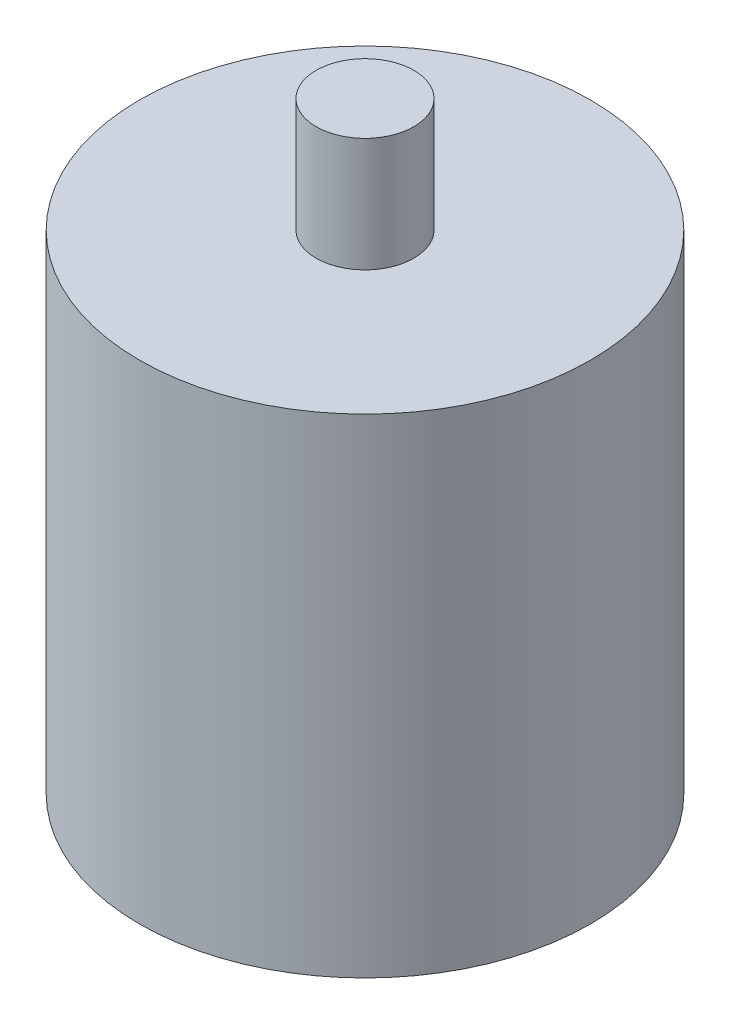
ISO-10303-21;
HEADER;
FILE_DESCRIPTION(('STEP AP214'),'2;1');
FILE_NAME('part.step','',(''),(''),'','','');
FILE_SCHEMA(('AUTOMOTIVE_DESIGN { 1 0 10303 214 1 1 1 1 }'));
ENDSEC;
DATA;
#1=APPLICATION_CONTEXT('core data for automotive mechanical design processes');
#2=APPLICATION_PROTOCOL_DEFINITION('international standard','automotive_design',2000,#1);
#3=PRODUCT_CONTEXT('',#1,'mechanical');
#4=PRODUCT('Part','Part','',(#3));
#5=PRODUCT_RELATED_PRODUCT_CATEGORY('part','',(#4));
#6=PRODUCT_DEFINITION_FORMATION('','',#4);
#7=PRODUCT_DEFINITION_CONTEXT('part definition',#1,'design');
#8=PRODUCT_DEFINITION('design','',#6,#7);
#9=PRODUCT_DEFINITION_SHAPE('','',#8);
#10=(LENGTH_UNIT() NAMED_UNIT(*) SI_UNIT(.MILLI.,.METRE.));
#11=(NAMED_UNIT(*) PLANE_ANGLE_UNIT() SI_UNIT($,.RADIAN.));
#12=(NAMED_UNIT(*) SI_UNIT($,.STERADIAN.) SOLID_ANGLE_UNIT());
#13=UNCERTAINTY_MEASURE_WITH_UNIT(LENGTH_MEASURE(1.E-05),#10,'distance_accuracy_value','');
#14=(GEOMETRIC_REPRESENTATION_CONTEXT(3) GLOBAL_UNCERTAINTY_ASSIGNED_CONTEXT((#13)) GLOBAL_UNIT_ASSIGNED_CONTEXT((#10,
#11,#12)) REPRESENTATION_CONTEXT('',''));
#15=CARTESIAN_POINT('',(0.,0.,0.));
#16=DIRECTION('',(0.,0.,1.));
#17=DIRECTION('',(1.,0.,0.));
#18=AXIS2_PLACEMENT_3D('',#15,#16,#17);
#19=CARTESIAN_POINT('',(0.,30.,0.));
#20=DIRECTION('',(0.,-1.,0.));
#21=DIRECTION('',(0.,0.,-1.));
#22=AXIS2_PLACEMENT_3D('',#19,#20,#21);
#23=CYLINDRICAL_SURFACE('',#22,13.85);
#24=CARTESIAN_POINT('',(0.,30.,0.));
#25=DIRECTION('',(0.,1.,0.));
#26=DIRECTION('',(0.,0.,1.));
#27=AXIS2_PLACEMENT_3D('',#24,#25,#26);
#28=CIRCLE('',#27,13.85);
#29=CARTESIAN_POINT('',(0.,30.,13.85));
#30=VERTEX_POINT('',#29);
#31=EDGE_CURVE('E48',#30,#30,#28,.T.);
#32=ORIENTED_EDGE('',*,*,#31,.F.);
#33=EDGE_LOOP('',(#32));
#34=FACE_BOUND('',#33,.T.);
#35=CARTESIAN_POINT('',(0.,0.,0.));
#36=DIRECTION('',(0.,1.,0.));
#37=DIRECTION('',(0.,0.,1.));
#38=AXIS2_PLACEMENT_3D('',#35,#36,#37);
#39=CIRCLE('',#38,13.85);
#40=CARTESIAN_POINT('',(0.,0.,13.85));
#41=VERTEX_POINT('',#40);
#42=EDGE_CURVE('E42',#41,#41,#39,.T.);
#43=ORIENTED_EDGE('',*,*,#42,.T.);
#44=EDGE_LOOP('',(#43));
#45=FACE_BOUND('',#44,.T.);
#46=ADVANCED_FACE('F41',(#34,#45),#23,.T.);
#47=CARTESIAN_POINT('',(0.,30.,0.));
#48=DIRECTION('',(0.,1.,0.));
#49=DIRECTION('',(0.,0.,1.));
#50=AXIS2_PLACEMENT_3D('',#47,#48,#49);
#51=PLANE('',#50);
#52=CARTESIAN_POINT('',(0.,30.,0.));
#53=DIRECTION('',(0.,1.,0.));
#54=DIRECTION('',(0.,0.,1.));
#55=AXIS2_PLACEMENT_3D('',#52,#53,#54);
#56=CIRCLE('',#55,3.);
#57=CARTESIAN_POINT('',(0.,30.,3.));
#58=VERTEX_POINT('',#57);
#59=EDGE_CURVE('E10',#58,#58,#56,.T.);
#60=ORIENTED_EDGE('',*,*,#59,.F.);
#61=EDGE_LOOP('',(#60));
#62=FACE_BOUND('',#61,.T.);
#63=ORIENTED_EDGE('',*,*,#31,.T.);
#64=EDGE_LOOP('',(#63));
#65=FACE_BOUND('',#64,.T.);
#66=ADVANCED_FACE('F94',(#62,#65),#51,.T.);
#67=CARTESIAN_POINT('',(0.,0.,0.));
#68=DIRECTION('',(0.,1.,0.));
#69=DIRECTION('',(0.,0.,1.));
#70=AXIS2_PLACEMENT_3D('',#67,#68,#69);
#71=PLANE('',#70);
#72=CARTESIAN_POINT('',(8.,0.,0.));
#73=DIRECTION('',(0.,1.,0.));
#74=DIRECTION('',(0.,0.,1.));
#75=AXIS2_PLACEMENT_3D('',#72,#73,#74);
#76=CIRCLE('',#75,1.5);
#77=CARTESIAN_POINT('',(8.,0.,1.5));
#78=VERTEX_POINT('',#77);
#79=EDGE_CURVE('E77',#78,#78,#76,.T.);
#80=ORIENTED_EDGE('',*,*,#79,.T.);
#81=EDGE_LOOP('',(#80));
#82=FACE_BOUND('',#81,.T.);
#83=CARTESIAN_POINT('',(-8.,0.,0.));
#84=DIRECTION('',(0.,1.,0.));
#85=DIRECTION('',(0.,0.,1.));
#86=AXIS2_PLACEMENT_3D('',#83,#84,#85);
#87=CIRCLE('',#86,1.5);
#88=CARTESIAN_POINT('',(-8.,0.,1.5));
#89=VERTEX_POINT('',#88);
#90=EDGE_CURVE('E71',#89,#89,#87,.T.);
#91=ORIENTED_EDGE('',*,*,#90,.T.);
#92=EDGE_LOOP('',(#91));
#93=FACE_BOUND('',#92,.T.);
#94=CARTESIAN_POINT('',(0.,0.,-9.5));
#95=DIRECTION('',(0.,1.,0.));
#96=DIRECTION('',(0.,0.,1.));
#97=AXIS2_PLACEMENT_3D('',#94,#95,#96);
#98=CIRCLE('',#97,1.5);
#99=CARTESIAN_POINT('',(0.,0.,-8.));
#100=VERTEX_POINT('',#99);
#101=EDGE_CURVE('E70',#100,#100,#98,.T.);
#102=ORIENTED_EDGE('',*,*,#101,.T.);
#103=EDGE_LOOP('',(#102));
#104=FACE_BOUND('',#103,.T.);
#105=CARTESIAN_POINT('',(0.,0.,9.5));
#106=DIRECTION('',(0.,1.,0.));
#107=DIRECTION('',(0.,0.,1.));
#108=AXIS2_PLACEMENT_3D('',#105,#106,#107);
#109=CIRCLE('',#108,1.5);
#110=CARTESIAN_POINT('',(0.,0.,11.));
#111=VERTEX_POINT('',#110);
#112=EDGE_CURVE('E62',#111,#111,#109,.T.);
#113=ORIENTED_EDGE('',*,*,#112,.T.);
#114=EDGE_LOOP('',(#113));
#115=FACE_BOUND('',#114,.T.);
#116=ORIENTED_EDGE('',*,*,#42,.F.);
#117=EDGE_LOOP('',(#116));
#118=FACE_BOUND('',#117,.T.);
#119=ADVANCED_FACE('F97',(#82,#93,#104,#115,#118),#71,.F.);
#120=CARTESIAN_POINT('',(0.,37.,0.));
#121=DIRECTION('',(0.,-1.,0.));
#122=DIRECTION('',(0.,0.,-1.));
#123=AXIS2_PLACEMENT_3D('',#120,#121,#122);
#124=CYLINDRICAL_SURFACE('',#123,3.);
#125=CARTESIAN_POINT('',(0.,37.,0.));
#126=DIRECTION('',(0.,1.,0.));
#127=DIRECTION('',(0.,0.,1.));
#128=AXIS2_PLACEMENT_3D('',#125,#126,#127);
#129=CIRCLE('',#128,3.);
#130=CARTESIAN_POINT('',(0.,37.,3.));
#131=VERTEX_POINT('',#130);
#132=EDGE_CURVE('E53',#131,#131,#129,.T.);
#133=ORIENTED_EDGE('',*,*,#132,.F.);
#134=EDGE_LOOP('',(#133));
#135=FACE_BOUND('',#134,.T.);
#136=ORIENTED_EDGE('',*,*,#59,.T.);
#137=EDGE_LOOP('',(#136));
#138=FACE_BOUND('',#137,.T.);
#139=ADVANCED_FACE('F107',(#135,#138),#124,.T.);
#140=CARTESIAN_POINT('',(0.,37.,0.));
#141=DIRECTION('',(0.,1.,0.));
#142=DIRECTION('',(0.,0.,1.));
#143=AXIS2_PLACEMENT_3D('',#140,#141,#142);
#144=PLANE('',#143);
#145=ORIENTED_EDGE('',*,*,#132,.T.);
#146=EDGE_LOOP('',(#145));
#147=FACE_BOUND('',#146,.T.);
#148=ADVANCED_FACE('F113',(#147),#144,.T.);
#149=CARTESIAN_POINT('',(0.,4.,9.5));
#150=DIRECTION('',(0.,-1.,0.));
#151=DIRECTION('',(0.,0.,-1.));
#152=AXIS2_PLACEMENT_3D('',#149,#150,#151);
#153=CYLINDRICAL_SURFACE('',#152,1.5);
#154=CARTESIAN_POINT('',(0.,4.,9.5));
#155=DIRECTION('',(0.,1.,0.));
#156=DIRECTION('',(0.,0.,1.));
#157=AXIS2_PLACEMENT_3D('',#154,#155,#156);
#158=CIRCLE('',#157,1.5);
#159=CARTESIAN_POINT('',(0.,4.,11.));
#160=VERTEX_POINT('',#159);
#161=EDGE_CURVE('E59',#160,#160,#158,.T.);
#162=ORIENTED_EDGE('',*,*,#161,.T.);
#163=EDGE_LOOP('',(#162));
#164=FACE_BOUND('',#163,.T.);
#165=ORIENTED_EDGE('',*,*,#112,.F.);
#166=EDGE_LOOP('',(#165));
#167=FACE_BOUND('',#166,.T.);
#168=ADVANCED_FACE('F122',(#164,#167),#153,.F.);
#169=CARTESIAN_POINT('',(0.,4.,9.5));
#170=DIRECTION('',(0.,1.,0.));
#171=DIRECTION('',(0.,0.,1.));
#172=AXIS2_PLACEMENT_3D('',#169,#170,#171);
#173=PLANE('',#172);
#174=ORIENTED_EDGE('',*,*,#161,.F.);
#175=EDGE_LOOP('',(#174));
#176=FACE_BOUND('',#175,.T.);
#177=ADVANCED_FACE('F123',(#176),#173,.F.);
#178=CARTESIAN_POINT('',(0.,4.,-9.5));
#179=DIRECTION('',(0.,-1.,0.));
#180=DIRECTION('',(0.,0.,-1.));
#181=AXIS2_PLACEMENT_3D('',#178,#179,#180);
#182=CYLINDRICAL_SURFACE('',#181,1.5);
#183=CARTESIAN_POINT('',(0.,4.,-9.5));
#184=DIRECTION('',(0.,1.,0.));
#185=DIRECTION('',(0.,0.,1.));
#186=AXIS2_PLACEMENT_3D('',#183,#184,#185);
#187=CIRCLE('',#186,1.5);
#188=CARTESIAN_POINT('',(0.,4.,-8.));
#189=VERTEX_POINT('',#188);
#190=EDGE_CURVE('E61',#189,#189,#187,.T.);
#191=ORIENTED_EDGE('',*,*,#190,.T.);
#192=EDGE_LOOP('',(#191));
#193=FACE_BOUND('',#192,.T.);
#194=ORIENTED_EDGE('',*,*,#101,.F.);
#195=EDGE_LOOP('',(#194));
#196=FACE_BOUND('',#195,.T.);
#197=ADVANCED_FACE('F127',(#193,#196),#182,.F.);
#198=CARTESIAN_POINT('',(0.,4.,-9.5));
#199=DIRECTION('',(0.,1.,0.));
#200=DIRECTION('',(0.,0.,1.));
#201=AXIS2_PLACEMENT_3D('',#198,#199,#200);
#202=PLANE('',#201);
#203=ORIENTED_EDGE('',*,*,#190,.F.);
#204=EDGE_LOOP('',(#203));
#205=FACE_BOUND('',#204,.T.);
#206=ADVANCED_FACE('F128',(#205),#202,.F.);
#207=CARTESIAN_POINT('',(-8.,4.,0.));
#208=DIRECTION('',(0.,-1.,0.));
#209=DIRECTION('',(0.,0.,-1.));
#210=AXIS2_PLACEMENT_3D('',#207,#208,#209);
#211=CYLINDRICAL_SURFACE('',#210,1.5);
#212=CARTESIAN_POINT('',(-8.,4.,0.));
#213=DIRECTION('',(0.,1.,0.));
#214=DIRECTION('',(0.,0.,1.));
#215=AXIS2_PLACEMENT_3D('',#212,#213,#214);
#216=CIRCLE('',#215,1.5);
#217=CARTESIAN_POINT('',(-8.,4.,1.5));
#218=VERTEX_POINT('',#217);
#219=EDGE_CURVE('E66',#218,#218,#216,.T.);
#220=ORIENTED_EDGE('',*,*,#219,.T.);
#221=EDGE_LOOP('',(#220));
#222=FACE_BOUND('',#221,.T.);
#223=ORIENTED_EDGE('',*,*,#90,.F.);
#224=EDGE_LOOP('',(#223));
#225=FACE_BOUND('',#224,.T.);
#226=ADVANCED_FACE('F134',(#222,#225),#211,.F.);
#227=CARTESIAN_POINT('',(-8.,4.,0.));
#228=DIRECTION('',(0.,1.,0.));
#229=DIRECTION('',(0.,0.,1.));
#230=AXIS2_PLACEMENT_3D('',#227,#228,#229);
#231=PLANE('',#230);
#232=ORIENTED_EDGE('',*,*,#219,.F.);
#233=EDGE_LOOP('',(#232));
#234=FACE_BOUND('',#233,.T.);
#235=ADVANCED_FACE('F93',(#234),#231,.F.);
#236=CARTESIAN_POINT('',(8.,4.,0.));
#237=DIRECTION('',(0.,-1.,0.));
#238=DIRECTION('',(0.,0.,-1.));
#239=AXIS2_PLACEMENT_3D('',#236,#237,#238);
#240=CYLINDRICAL_SURFACE('',#239,1.5);
#241=CARTESIAN_POINT('',(8.,4.,0.));
#242=DIRECTION('',(0.,1.,0.));
#243=DIRECTION('',(0.,0.,1.));
#244=AXIS2_PLACEMENT_3D('',#241,#242,#243);
#245=CIRCLE('',#244,1.5);
#246=CARTESIAN_POINT('',(8.,4.,1.5));
#247=VERTEX_POINT('',#246);
#248=EDGE_CURVE('E60',#247,#247,#245,.T.);
#249=ORIENTED_EDGE('',*,*,#248,.T.);
#250=EDGE_LOOP('',(#249));
#251=FACE_BOUND('',#250,.T.);
#252=ORIENTED_EDGE('',*,*,#79,.F.);
#253=EDGE_LOOP('',(#252));
#254=FACE_BOUND('',#253,.T.);
#255=ADVANCED_FACE('F85',(#251,#254),#240,.F.);
#256=CARTESIAN_POINT('',(8.,4.,0.));
#257=DIRECTION('',(0.,1.,0.));
#258=DIRECTION('',(0.,0.,1.));
#259=AXIS2_PLACEMENT_3D('',#256,#257,#258);
#260=PLANE('',#259);
#261=ORIENTED_EDGE('',*,*,#248,.F.);
#262=EDGE_LOOP('',(#261));
#263=FACE_BOUND('',#262,.T.);
#264=ADVANCED_FACE('F81',(#263),#260,.F.);
#265=CLOSED_SHELL('',(#46,#66,#119,#139,#148,#168,#177,#197,#206,#226,#235,#255,#264));
#266=MANIFOLD_SOLID_BREP('B2',#265);
#267=ADVANCED_BREP_SHAPE_REPRESENTATION('',(#18,#266),#14);
#268=SHAPE_DEFINITION_REPRESENTATION(#9,#267);
ENDSEC;
END-ISO-10303-21;
